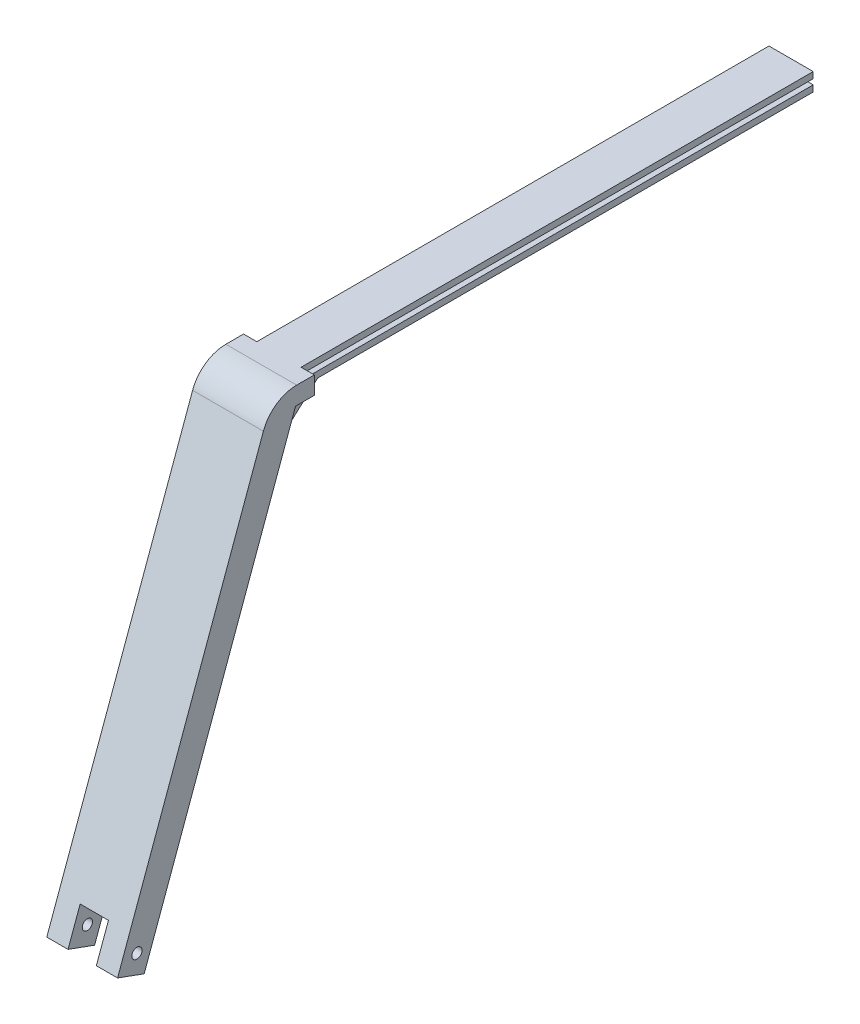
ISO-10303-21;
HEADER;
FILE_DESCRIPTION(('STEP AP214'),'2;1');
FILE_NAME('part.step','',(''),(''),'','','');
FILE_SCHEMA(('AUTOMOTIVE_DESIGN { 1 0 10303 214 1 1 1 1 }'));
ENDSEC;
DATA;
#1=APPLICATION_CONTEXT('core data for automotive mechanical design processes');
#2=APPLICATION_PROTOCOL_DEFINITION('international standard','automotive_design',2000,#1);
#3=PRODUCT_CONTEXT('',#1,'mechanical');
#4=PRODUCT('Part','Part','',(#3));
#5=PRODUCT_RELATED_PRODUCT_CATEGORY('part','',(#4));
#6=PRODUCT_DEFINITION_FORMATION('','',#4);
#7=PRODUCT_DEFINITION_CONTEXT('part definition',#1,'design');
#8=PRODUCT_DEFINITION('design','',#6,#7);
#9=PRODUCT_DEFINITION_SHAPE('','',#8);
#10=(LENGTH_UNIT() NAMED_UNIT(*) SI_UNIT(.MILLI.,.METRE.));
#11=(NAMED_UNIT(*) PLANE_ANGLE_UNIT() SI_UNIT($,.RADIAN.));
#12=(NAMED_UNIT(*) SI_UNIT($,.STERADIAN.) SOLID_ANGLE_UNIT());
#13=UNCERTAINTY_MEASURE_WITH_UNIT(LENGTH_MEASURE(1.E-05),#10,'distance_accuracy_value','');
#14=(GEOMETRIC_REPRESENTATION_CONTEXT(3) GLOBAL_UNCERTAINTY_ASSIGNED_CONTEXT((#13)) GLOBAL_UNIT_ASSIGNED_CONTEXT((#10,
#11,#12)) REPRESENTATION_CONTEXT('',''));
#15=CARTESIAN_POINT('',(0.,0.,0.));
#16=DIRECTION('',(0.,0.,1.));
#17=DIRECTION('',(1.,0.,0.));
#18=AXIS2_PLACEMENT_3D('',#15,#16,#17);
#19=CARTESIAN_POINT('',(-10.,2.7361611466053,7.51754096628727));
#20=DIRECTION('',(0.,0.93969262078591,-0.342020143325663));
#21=DIRECTION('',(0.,0.342020143325663,0.939692620785911));
#22=AXIS2_PLACEMENT_3D('',#19,#20,#21);
#23=PLANE('',#22);
#24=DIRECTION('',(1.,0.,0.));
#25=VECTOR('',#24,1.);
#26=CARTESIAN_POINT('',(-10.,0.,0.));
#27=LINE('',#26,#25);
#28=CARTESIAN_POINT('',(-10.,0.,0.));
#29=VERTEX_POINT('',#28);
#30=CARTESIAN_POINT('',(-4.,0.,0.));
#31=VERTEX_POINT('',#30);
#32=EDGE_CURVE('E222',#29,#31,#27,.T.);
#33=ORIENTED_EDGE('',*,*,#32,.T.);
#34=DIRECTION('',(0.,0.342020143325663,0.939692620785911));
#35=VECTOR('',#34,1.);
#36=CARTESIAN_POINT('',(-4.,2.7361611466053,7.51754096628727));
#37=LINE('',#36,#35);
#38=CARTESIAN_POINT('',(-4.,2.73616114660533,7.51754096628727));
#39=VERTEX_POINT('',#38);
#40=EDGE_CURVE('E11',#31,#39,#37,.T.);
#41=ORIENTED_EDGE('',*,*,#40,.T.);
#42=DIRECTION('',(1.,0.,0.));
#43=VECTOR('',#42,1.);
#44=CARTESIAN_POINT('',(-10.,2.7361611466053,7.51754096628727));
#45=LINE('',#44,#43);
#46=CARTESIAN_POINT('',(-10.,2.73616114660533,7.51754096628727));
#47=VERTEX_POINT('',#46);
#48=EDGE_CURVE('E58',#47,#39,#45,.T.);
#49=ORIENTED_EDGE('',*,*,#48,.F.);
#50=DIRECTION('',(0.,0.342020143325663,0.93969262078591));
#51=VECTOR('',#50,1.);
#52=CARTESIAN_POINT('',(-10.,2.7361611466053,7.51754096628727));
#53=LINE('',#52,#51);
#54=EDGE_CURVE('E400',#29,#47,#53,.T.);
#55=ORIENTED_EDGE('',*,*,#54,.F.);
#56=EDGE_LOOP('',(#33,#41,#49,#55));
#57=FACE_BOUND('',#56,.T.);
#58=ADVANCED_FACE('F35',(#57),#23,.F.);
#59=CARTESIAN_POINT('',(-6.25,-192.,-192.766502526278));
#60=DIRECTION('',(1.,0.,0.));
#61=DIRECTION('',(0.,0.,-1.));
#62=AXIS2_PLACEMENT_3D('',#59,#60,#61);
#63=PLANE('',#62);
#64=DIRECTION('',(0.,1.,0.));
#65=VECTOR('',#64,1.);
#66=CARTESIAN_POINT('',(-6.25,-192.,-192.766502526278));
#67=LINE('',#66,#65);
#68=CARTESIAN_POINT('',(-6.25,120.75,-192.766502526278));
#69=VERTEX_POINT('',#68);
#70=CARTESIAN_POINT('',(-6.25,122.5,-192.766502526278));
#71=VERTEX_POINT('',#70);
#72=EDGE_CURVE('E320',#69,#71,#67,.T.);
#73=ORIENTED_EDGE('',*,*,#72,.F.);
#74=DIRECTION('',(0.,0.,-1.));
#75=VECTOR('',#74,1.);
#76=CARTESIAN_POINT('',(-6.25,120.75,-48.0750068998992));
#77=LINE('',#76,#75);
#78=CARTESIAN_POINT('',(-6.25,120.75,-48.0750068998992));
#79=VERTEX_POINT('',#78);
#80=EDGE_CURVE('E254',#79,#69,#77,.T.);
#81=ORIENTED_EDGE('',*,*,#80,.F.);
#82=DIRECTION('',(0.,1.,0.));
#83=VECTOR('',#82,1.);
#84=CARTESIAN_POINT('',(-6.25,-192.,-48.0750068998992));
#85=LINE('',#84,#83);
#86=CARTESIAN_POINT('',(-6.25,122.5,-48.0750068998992));
#87=VERTEX_POINT('',#86);
#88=EDGE_CURVE('E315',#79,#87,#85,.T.);
#89=ORIENTED_EDGE('',*,*,#88,.T.);
#90=DIRECTION('',(0.,0.,-1.));
#91=VECTOR('',#90,1.);
#92=CARTESIAN_POINT('',(-6.25,122.5,-192.766502526278));
#93=LINE('',#92,#91);
#94=EDGE_CURVE('E311',#87,#71,#93,.T.);
#95=ORIENTED_EDGE('',*,*,#94,.T.);
#96=EDGE_LOOP('',(#73,#81,#89,#95));
#97=FACE_BOUND('',#96,.T.);
#98=ADVANCED_FACE('F442',(#97),#63,.F.);
#99=CARTESIAN_POINT('',(6.25,-192.,-192.766502526278));
#100=DIRECTION('',(-1.,0.,0.));
#101=DIRECTION('',(0.,0.,1.));
#102=AXIS2_PLACEMENT_3D('',#99,#100,#101);
#103=PLANE('',#102);
#104=DIRECTION('',(0.,1.,0.));
#105=VECTOR('',#104,1.);
#106=CARTESIAN_POINT('',(6.25,-192.,-48.0750068998992));
#107=LINE('',#106,#105);
#108=CARTESIAN_POINT('',(6.25,120.75,-48.0750068998992));
#109=VERTEX_POINT('',#108);
#110=CARTESIAN_POINT('',(6.25,122.5,-48.0750068998992));
#111=VERTEX_POINT('',#110);
#112=EDGE_CURVE('E331',#109,#111,#107,.T.);
#113=ORIENTED_EDGE('',*,*,#112,.F.);
#114=DIRECTION('',(0.,0.,-1.));
#115=VECTOR('',#114,1.);
#116=CARTESIAN_POINT('',(6.25,120.75,-48.0750068998992));
#117=LINE('',#116,#115);
#118=CARTESIAN_POINT('',(6.25,120.75,-192.766502526278));
#119=VERTEX_POINT('',#118);
#120=EDGE_CURVE('E258',#109,#119,#117,.T.);
#121=ORIENTED_EDGE('',*,*,#120,.T.);
#122=DIRECTION('',(0.,1.,0.));
#123=VECTOR('',#122,1.);
#124=CARTESIAN_POINT('',(6.25,-192.,-192.766502526278));
#125=LINE('',#124,#123);
#126=CARTESIAN_POINT('',(6.25,122.5,-192.766502526278));
#127=VERTEX_POINT('',#126);
#128=EDGE_CURVE('E328',#119,#127,#125,.T.);
#129=ORIENTED_EDGE('',*,*,#128,.T.);
#130=DIRECTION('',(0.,0.,1.));
#131=VECTOR('',#130,1.);
#132=CARTESIAN_POINT('',(6.25,122.5,-192.766502526278));
#133=LINE('',#132,#131);
#134=EDGE_CURVE('E306',#127,#111,#133,.T.);
#135=ORIENTED_EDGE('',*,*,#134,.T.);
#136=EDGE_LOOP('',(#113,#121,#129,#135));
#137=FACE_BOUND('',#136,.T.);
#138=ADVANCED_FACE('F447',(#137),#103,.F.);
#139=CARTESIAN_POINT('',(10.,-117.5,42.7665025262783));
#140=DIRECTION('',(0.,0.342020143325665,0.93969262078591));
#141=DIRECTION('',(0.,-0.93969262078591,0.342020143325665));
#142=AXIS2_PLACEMENT_3D('',#139,#140,#141);
#143=PLANE('',#142);
#144=DIRECTION('',(-1.,0.,0.));
#145=VECTOR('',#144,1.);
#146=CARTESIAN_POINT('',(9.99999999999997,9.39692620785909,-3.42020143325663));
#147=LINE('',#146,#145);
#148=CARTESIAN_POINT('',(4.,9.39692620785912,-3.42020143325664));
#149=VERTEX_POINT('',#148);
#150=CARTESIAN_POINT('',(-4.,9.3969262078591,-3.42020143325664));
#151=VERTEX_POINT('',#150);
#152=EDGE_CURVE('E403',#149,#151,#147,.T.);
#153=ORIENTED_EDGE('',*,*,#152,.T.);
#154=DIRECTION('',(0.,-0.93969262078591,0.342020143325665));
#155=VECTOR('',#154,1.);
#156=CARTESIAN_POINT('',(-4.,-117.5,42.7665025262783));
#157=LINE('',#156,#155);
#158=EDGE_CURVE('E406',#151,#31,#157,.T.);
#159=ORIENTED_EDGE('',*,*,#158,.T.);
#160=ORIENTED_EDGE('',*,*,#32,.F.);
#161=DIRECTION('',(0.,0.939692620785909,-0.342020143325665));
#162=VECTOR('',#161,1.);
#163=CARTESIAN_POINT('',(-10.,-117.5,42.7665025262783));
#164=LINE('',#163,#162);
#165=CARTESIAN_POINT('',(-10.,117.5,-42.7665025262783));
#166=VERTEX_POINT('',#165);
#167=EDGE_CURVE('E359',#29,#166,#164,.T.);
#168=ORIENTED_EDGE('',*,*,#167,.T.);
#169=DIRECTION('',(-1.,0.,0.));
#170=VECTOR('',#169,1.);
#171=CARTESIAN_POINT('',(10.,117.5,-42.7665025262783));
#172=LINE('',#171,#170);
#173=CARTESIAN_POINT('',(-6.25,117.5,-42.7665025262783));
#174=VERTEX_POINT('',#173);
#175=EDGE_CURVE('E368',#174,#166,#172,.T.);
#176=ORIENTED_EDGE('',*,*,#175,.F.);
#177=DIRECTION('',(0.,-0.939692620785909,0.342020143325666));
#178=VECTOR('',#177,1.);
#179=CARTESIAN_POINT('',(-6.25,103.762612902727,-37.7665025262783));
#180=LINE('',#179,#178);
#181=CARTESIAN_POINT('',(-6.25,103.762612902727,-37.7665025262783));
#182=VERTEX_POINT('',#181);
#183=EDGE_CURVE('E289',#174,#182,#180,.T.);
#184=ORIENTED_EDGE('',*,*,#183,.T.);
#185=DIRECTION('',(1.,0.,0.));
#186=VECTOR('',#185,1.);
#187=CARTESIAN_POINT('',(-6.25,103.762612902727,-37.7665025262783));
#188=LINE('',#187,#186);
#189=CARTESIAN_POINT('',(6.25,103.762612902727,-37.7665025262783));
#190=VERTEX_POINT('',#189);
#191=EDGE_CURVE('E295',#182,#190,#188,.T.);
#192=ORIENTED_EDGE('',*,*,#191,.T.);
#193=DIRECTION('',(0.,-0.939692620785909,0.342020143325666));
#194=VECTOR('',#193,1.);
#195=CARTESIAN_POINT('',(6.25,103.762612902727,-37.7665025262783));
#196=LINE('',#195,#194);
#197=CARTESIAN_POINT('',(6.25,117.5,-42.7665025262783));
#198=VERTEX_POINT('',#197);
#199=EDGE_CURVE('E298',#198,#190,#196,.T.);
#200=ORIENTED_EDGE('',*,*,#199,.F.);
#201=CARTESIAN_POINT('',(10.,117.5,-42.7665025262783));
#202=VERTEX_POINT('',#201);
#203=EDGE_CURVE('E369',#202,#198,#172,.T.);
#204=ORIENTED_EDGE('',*,*,#203,.F.);
#205=DIRECTION('',(0.,0.939692620785909,-0.342020143325665));
#206=VECTOR('',#205,1.);
#207=CARTESIAN_POINT('',(10.,-117.5,42.7665025262783));
#208=LINE('',#207,#206);
#209=CARTESIAN_POINT('',(10.,0.,0.));
#210=VERTEX_POINT('',#209);
#211=EDGE_CURVE('E351',#210,#202,#208,.T.);
#212=ORIENTED_EDGE('',*,*,#211,.F.);
#213=CARTESIAN_POINT('',(4.,0.,0.));
#214=VERTEX_POINT('',#213);
#215=EDGE_CURVE('E239',#214,#210,#27,.T.);
#216=ORIENTED_EDGE('',*,*,#215,.F.);
#217=DIRECTION('',(0.,0.93969262078591,-0.342020143325665));
#218=VECTOR('',#217,1.);
#219=CARTESIAN_POINT('',(4.00000000000005,-117.5,42.7665025262783));
#220=LINE('',#219,#218);
#221=EDGE_CURVE('E51',#214,#149,#220,.T.);
#222=ORIENTED_EDGE('',*,*,#221,.T.);
#223=EDGE_LOOP('',(#153,#159,#160,#168,#176,#184,#192,#200,#204,#212,#216,#222));
#224=FACE_BOUND('',#223,.T.);
#225=ADVANCED_FACE('F398',(#224),#143,.F.);
#226=CARTESIAN_POINT('',(10.,117.5,-192.766502526278));
#227=DIRECTION('',(0.,1.,0.));
#228=DIRECTION('',(0.,0.,1.));
#229=AXIS2_PLACEMENT_3D('',#226,#227,#228);
#230=PLANE('',#229);
#231=DIRECTION('',(0.,0.,1.));
#232=VECTOR('',#231,1.);
#233=CARTESIAN_POINT('',(-6.25,117.5,-42.7665025262783));
#234=LINE('',#233,#232);
#235=CARTESIAN_POINT('',(-6.25,117.5,-48.0750068998992));
#236=VERTEX_POINT('',#235);
#237=EDGE_CURVE('E287',#236,#174,#234,.T.);
#238=ORIENTED_EDGE('',*,*,#237,.T.);
#239=ORIENTED_EDGE('',*,*,#175,.T.);
#240=DIRECTION('',(0.,0.,-1.));
#241=VECTOR('',#240,1.);
#242=CARTESIAN_POINT('',(-10.,117.5,-192.766502526278));
#243=LINE('',#242,#241);
#244=CARTESIAN_POINT('',(-10.,117.5,-48.0750068998992));
#245=VERTEX_POINT('',#244);
#246=EDGE_CURVE('E348',#166,#245,#243,.T.);
#247=ORIENTED_EDGE('',*,*,#246,.T.);
#248=DIRECTION('',(1.,0.,0.));
#249=VECTOR('',#248,1.);
#250=CARTESIAN_POINT('',(10.,117.5,-48.0750068998992));
#251=LINE('',#250,#249);
#252=EDGE_CURVE('E319',#245,#236,#251,.T.);
#253=ORIENTED_EDGE('',*,*,#252,.T.);
#254=EDGE_LOOP('',(#238,#239,#247,#253));
#255=FACE_BOUND('',#254,.T.);
#256=ADVANCED_FACE('F510',(#255),#230,.F.);
#257=DIRECTION('',(0.,0.,1.));
#258=VECTOR('',#257,1.);
#259=CARTESIAN_POINT('',(6.25,117.5,-192.766502526278));
#260=LINE('',#259,#258);
#261=CARTESIAN_POINT('',(6.25,117.5,-192.766502526278));
#262=VERTEX_POINT('',#261);
#263=CARTESIAN_POINT('',(6.25,117.5,-52.7665025262783));
#264=VERTEX_POINT('',#263);
#265=EDGE_CURVE('E340',#262,#264,#260,.T.);
#266=ORIENTED_EDGE('',*,*,#265,.T.);
#267=DIRECTION('',(1.,0.,0.));
#268=VECTOR('',#267,1.);
#269=CARTESIAN_POINT('',(-6.25,117.5,-52.7665025262783));
#270=LINE('',#269,#268);
#271=CARTESIAN_POINT('',(-6.25,117.5,-52.7665025262783));
#272=VERTEX_POINT('',#271);
#273=EDGE_CURVE('E303',#272,#264,#270,.T.);
#274=ORIENTED_EDGE('',*,*,#273,.F.);
#275=DIRECTION('',(0.,0.,-1.));
#276=VECTOR('',#275,1.);
#277=CARTESIAN_POINT('',(-6.25,117.5,-192.766502526278));
#278=LINE('',#277,#276);
#279=CARTESIAN_POINT('',(-6.25,117.5,-192.766502526278));
#280=VERTEX_POINT('',#279);
#281=EDGE_CURVE('E342',#272,#280,#278,.T.);
#282=ORIENTED_EDGE('',*,*,#281,.T.);
#283=DIRECTION('',(-1.,0.,0.));
#284=VECTOR('',#283,1.);
#285=CARTESIAN_POINT('',(10.,117.5,-192.766502526278));
#286=LINE('',#285,#284);
#287=EDGE_CURVE('E365',#262,#280,#286,.T.);
#288=ORIENTED_EDGE('',*,*,#287,.F.);
#289=EDGE_LOOP('',(#266,#274,#282,#288));
#290=FACE_BOUND('',#289,.T.);
#291=ADVANCED_FACE('F511',(#290),#230,.F.);
#292=CARTESIAN_POINT('',(10.,122.5,-192.766502526278));
#293=DIRECTION('',(0.,-1.,0.));
#294=DIRECTION('',(0.,0.,-1.));
#295=AXIS2_PLACEMENT_3D('',#292,#293,#294);
#296=PLANE('',#295);
#297=DIRECTION('',(-1.,0.,0.));
#298=VECTOR('',#297,1.);
#299=CARTESIAN_POINT('',(10.,122.5,-192.766502526278));
#300=LINE('',#299,#298);
#301=EDGE_CURVE('E356',#127,#71,#300,.T.);
#302=ORIENTED_EDGE('',*,*,#301,.T.);
#303=ORIENTED_EDGE('',*,*,#94,.F.);
#304=DIRECTION('',(1.,0.,0.));
#305=VECTOR('',#304,1.);
#306=CARTESIAN_POINT('',(-10.,122.5,-48.0750068998992));
#307=LINE('',#306,#305);
#308=CARTESIAN_POINT('',(-10.,122.5,-48.0750068998992));
#309=VERTEX_POINT('',#308);
#310=EDGE_CURVE('E308',#309,#87,#307,.T.);
#311=ORIENTED_EDGE('',*,*,#310,.F.);
#312=DIRECTION('',(0.,0.,1.));
#313=VECTOR('',#312,1.);
#314=CARTESIAN_POINT('',(-10.,122.5,-192.766502526278));
#315=LINE('',#314,#313);
#316=CARTESIAN_POINT('',(-10.,122.5,-43.0750068998992));
#317=VERTEX_POINT('',#316);
#318=EDGE_CURVE('E344',#309,#317,#315,.T.);
#319=ORIENTED_EDGE('',*,*,#318,.T.);
#320=DIRECTION('',(-1.,0.,0.));
#321=VECTOR('',#320,1.);
#322=CARTESIAN_POINT('',(10.,122.5,-43.0750068998992));
#323=LINE('',#322,#321);
#324=CARTESIAN_POINT('',(10.,122.5,-43.0750068998992));
#325=VERTEX_POINT('',#324);
#326=EDGE_CURVE('E377',#317,#325,#323,.F.);
#327=ORIENTED_EDGE('',*,*,#326,.T.);
#328=DIRECTION('',(0.,0.,1.));
#329=VECTOR('',#328,1.);
#330=CARTESIAN_POINT('',(10.,122.5,-192.766502526278));
#331=LINE('',#330,#329);
#332=CARTESIAN_POINT('',(10.,122.5,-48.0750068998992));
#333=VERTEX_POINT('',#332);
#334=EDGE_CURVE('E345',#333,#325,#331,.T.);
#335=ORIENTED_EDGE('',*,*,#334,.F.);
#336=DIRECTION('',(1.,0.,0.));
#337=VECTOR('',#336,1.);
#338=CARTESIAN_POINT('',(10.,122.5,-48.0750068998992));
#339=LINE('',#338,#337);
#340=EDGE_CURVE('E326',#111,#333,#339,.T.);
#341=ORIENTED_EDGE('',*,*,#340,.F.);
#342=ORIENTED_EDGE('',*,*,#134,.F.);
#343=EDGE_LOOP('',(#302,#303,#311,#319,#327,#335,#341,#342));
#344=FACE_BOUND('',#343,.T.);
#345=ADVANCED_FACE('F515',(#344),#296,.F.);
#346=CARTESIAN_POINT('',(10.,122.5,-36.0729315178021));
#347=DIRECTION('',(0.,-0.342020143325666,-0.93969262078591));
#348=DIRECTION('',(0.,0.93969262078591,-0.342020143325666));
#349=AXIS2_PLACEMENT_3D('',#346,#347,#348);
#350=PLANE('',#349);
#351=ORIENTED_EDGE('',*,*,#48,.T.);
#352=DIRECTION('',(0.,-0.939692620785909,0.342020143325666));
#353=VECTOR('',#352,1.);
#354=CARTESIAN_POINT('',(-4.,2.73616114660533,7.51754096628727));
#355=LINE('',#354,#353);
#356=CARTESIAN_POINT('',(-4.,12.1330873544644,4.09733953303061));
#357=VERTEX_POINT('',#356);
#358=EDGE_CURVE('E209',#357,#39,#355,.T.);
#359=ORIENTED_EDGE('',*,*,#358,.F.);
#360=DIRECTION('',(-1.,0.,0.));
#361=VECTOR('',#360,1.);
#362=CARTESIAN_POINT('',(-4.,12.1330873544644,4.09733953303061));
#363=LINE('',#362,#361);
#364=CARTESIAN_POINT('',(4.,12.1330873544644,4.09733953303061));
#365=VERTEX_POINT('',#364);
#366=EDGE_CURVE('E411',#365,#357,#363,.T.);
#367=ORIENTED_EDGE('',*,*,#366,.F.);
#368=DIRECTION('',(0.,0.93969262078591,-0.342020143325666));
#369=VECTOR('',#368,1.);
#370=CARTESIAN_POINT('',(4.,2.73616114660533,7.51754096628727));
#371=LINE('',#370,#369);
#372=CARTESIAN_POINT('',(4.,2.73616114660533,7.51754096628727));
#373=VERTEX_POINT('',#372);
#374=EDGE_CURVE('E217',#373,#365,#371,.T.);
#375=ORIENTED_EDGE('',*,*,#374,.F.);
#376=CARTESIAN_POINT('',(10.,2.7361611466053,7.51754096628727));
#377=VERTEX_POINT('',#376);
#378=EDGE_CURVE('E229',#373,#377,#45,.T.);
#379=ORIENTED_EDGE('',*,*,#378,.T.);
#380=DIRECTION('',(0.,-0.939692620785909,0.342020143325666));
#381=VECTOR('',#380,1.);
#382=CARTESIAN_POINT('',(10.,122.5,-36.0729315178021));
#383=LINE('',#382,#381);
#384=CARTESIAN_POINT('',(10.,115.920201433257,-33.6780806920401));
#385=VERTEX_POINT('',#384);
#386=EDGE_CURVE('E347',#385,#377,#383,.T.);
#387=ORIENTED_EDGE('',*,*,#386,.F.);
#388=DIRECTION('',(-1.,0.,0.));
#389=VECTOR('',#388,1.);
#390=CARTESIAN_POINT('',(10.,115.920201433257,-33.6780806920401));
#391=LINE('',#390,#389);
#392=CARTESIAN_POINT('',(-10.,115.920201433257,-33.6780806920401));
#393=VERTEX_POINT('',#392);
#394=EDGE_CURVE('E372',#385,#393,#391,.T.);
#395=ORIENTED_EDGE('',*,*,#394,.T.);
#396=DIRECTION('',(0.,-0.939692620785909,0.342020143325666));
#397=VECTOR('',#396,1.);
#398=CARTESIAN_POINT('',(-10.,122.5,-36.0729315178021));
#399=LINE('',#398,#397);
#400=EDGE_CURVE('E227',#393,#47,#399,.T.);
#401=ORIENTED_EDGE('',*,*,#400,.T.);
#402=EDGE_LOOP('',(#351,#359,#367,#375,#379,#387,#395,#401));
#403=FACE_BOUND('',#402,.T.);
#404=ADVANCED_FACE('F224',(#403),#350,.F.);
#405=ORIENTED_EDGE('',*,*,#203,.T.);
#406=DIRECTION('',(0.,0.,1.));
#407=VECTOR('',#406,1.);
#408=CARTESIAN_POINT('',(6.25,117.5,-42.7665025262783));
#409=LINE('',#408,#407);
#410=CARTESIAN_POINT('',(6.25,117.5,-48.0750068998992));
#411=VERTEX_POINT('',#410);
#412=EDGE_CURVE('E261',#411,#198,#409,.T.);
#413=ORIENTED_EDGE('',*,*,#412,.F.);
#414=DIRECTION('',(1.,0.,0.));
#415=VECTOR('',#414,1.);
#416=CARTESIAN_POINT('',(10.,117.5,-48.0750068998992));
#417=LINE('',#416,#415);
#418=CARTESIAN_POINT('',(10.,117.5,-48.0750068998992));
#419=VERTEX_POINT('',#418);
#420=EDGE_CURVE('E337',#411,#419,#417,.T.);
#421=ORIENTED_EDGE('',*,*,#420,.T.);
#422=DIRECTION('',(0.,0.,-1.));
#423=VECTOR('',#422,1.);
#424=CARTESIAN_POINT('',(10.,117.5,-192.766502526278));
#425=LINE('',#424,#423);
#426=EDGE_CURVE('E353',#202,#419,#425,.T.);
#427=ORIENTED_EDGE('',*,*,#426,.F.);
#428=EDGE_LOOP('',(#405,#413,#421,#427));
#429=FACE_BOUND('',#428,.T.);
#430=ADVANCED_FACE('F505',(#429),#230,.F.);
#431=CARTESIAN_POINT('',(10.,122.5,-192.766502526278));
#432=DIRECTION('',(0.,0.,1.));
#433=DIRECTION('',(1.,0.,0.));
#434=AXIS2_PLACEMENT_3D('',#431,#432,#433);
#435=PLANE('',#434);
#436=ORIENTED_EDGE('',*,*,#128,.F.);
#437=DIRECTION('',(1.,0.,0.));
#438=VECTOR('',#437,1.);
#439=CARTESIAN_POINT('',(6.25,120.75,-192.766502526278));
#440=LINE('',#439,#438);
#441=CARTESIAN_POINT('',(4.25,120.75,-192.766502526278));
#442=VERTEX_POINT('',#441);
#443=EDGE_CURVE('E244',#442,#119,#440,.T.);
#444=ORIENTED_EDGE('',*,*,#443,.F.);
#445=DIRECTION('',(0.,1.,0.));
#446=VECTOR('',#445,1.);
#447=CARTESIAN_POINT('',(4.25,120.75,-192.766502526278));
#448=LINE('',#447,#446);
#449=CARTESIAN_POINT('',(4.25,119.25,-192.766502526278));
#450=VERTEX_POINT('',#449);
#451=EDGE_CURVE('E253',#450,#442,#448,.T.);
#452=ORIENTED_EDGE('',*,*,#451,.F.);
#453=DIRECTION('',(-1.,0.,0.));
#454=VECTOR('',#453,1.);
#455=CARTESIAN_POINT('',(6.25,119.25,-192.766502526278));
#456=LINE('',#455,#454);
#457=CARTESIAN_POINT('',(6.25,119.25,-192.766502526278));
#458=VERTEX_POINT('',#457);
#459=EDGE_CURVE('E250',#458,#450,#456,.T.);
#460=ORIENTED_EDGE('',*,*,#459,.F.);
#461=EDGE_CURVE('E332',#262,#458,#125,.T.);
#462=ORIENTED_EDGE('',*,*,#461,.F.);
#463=ORIENTED_EDGE('',*,*,#287,.T.);
#464=CARTESIAN_POINT('',(-6.25,119.25,-192.766502526278));
#465=VERTEX_POINT('',#464);
#466=EDGE_CURVE('E316',#280,#465,#67,.T.);
#467=ORIENTED_EDGE('',*,*,#466,.T.);
#468=DIRECTION('',(-1.,0.,0.));
#469=VECTOR('',#468,1.);
#470=CARTESIAN_POINT('',(-6.25,119.25,-192.766502526278));
#471=LINE('',#470,#469);
#472=CARTESIAN_POINT('',(-4.25,119.25,-192.766502526278));
#473=VERTEX_POINT('',#472);
#474=EDGE_CURVE('E271',#473,#465,#471,.T.);
#475=ORIENTED_EDGE('',*,*,#474,.F.);
#476=DIRECTION('',(0.,-1.,0.));
#477=VECTOR('',#476,1.);
#478=CARTESIAN_POINT('',(-4.25,120.75,-192.766502526278));
#479=LINE('',#478,#477);
#480=CARTESIAN_POINT('',(-4.25,120.75,-192.766502526278));
#481=VERTEX_POINT('',#480);
#482=EDGE_CURVE('E232',#481,#473,#479,.T.);
#483=ORIENTED_EDGE('',*,*,#482,.F.);
#484=DIRECTION('',(1.,0.,0.));
#485=VECTOR('',#484,1.);
#486=CARTESIAN_POINT('',(-6.25,120.75,-192.766502526278));
#487=LINE('',#486,#485);
#488=EDGE_CURVE('E228',#69,#481,#487,.T.);
#489=ORIENTED_EDGE('',*,*,#488,.F.);
#490=ORIENTED_EDGE('',*,*,#72,.T.);
#491=ORIENTED_EDGE('',*,*,#301,.F.);
#492=EDGE_LOOP('',(#436,#444,#452,#460,#462,#463,#467,#475,#483,#489,#490,#491));
#493=FACE_BOUND('',#492,.T.);
#494=ADVANCED_FACE('F499',(#493),#435,.F.);
#495=CARTESIAN_POINT('',(10.,0.,0.));
#496=DIRECTION('',(1.,0.,0.));
#497=DIRECTION('',(0.,0.,-1.));
#498=AXIS2_PLACEMENT_3D('',#495,#496,#497);
#499=PLANE('',#498);
#500=CARTESIAN_POINT('',(10.,6.06654367723219,2.04866976651531));
#501=DIRECTION('',(1.,0.,0.));
#502=DIRECTION('',(0.,0.,-1.));
#503=AXIS2_PLACEMENT_3D('',#500,#501,#502);
#504=CIRCLE('',#503,1.45);
#505=CARTESIAN_POINT('',(10.,6.06654367723219,0.598669766515311));
#506=VERTEX_POINT('',#505);
#507=EDGE_CURVE('E417',#506,#506,#504,.T.);
#508=ORIENTED_EDGE('',*,*,#507,.F.);
#509=EDGE_LOOP('',(#508));
#510=FACE_BOUND('',#509,.T.);
#511=DIRECTION('',(0.,0.342020143325663,0.93969262078591));
#512=VECTOR('',#511,1.);
#513=CARTESIAN_POINT('',(10.,2.7361611466053,7.51754096628727));
#514=LINE('',#513,#512);
#515=EDGE_CURVE('E236',#210,#377,#514,.T.);
#516=ORIENTED_EDGE('',*,*,#515,.F.);
#517=ORIENTED_EDGE('',*,*,#211,.T.);
#518=ORIENTED_EDGE('',*,*,#426,.T.);
#519=DIRECTION('',(0.,-1.,0.));
#520=VECTOR('',#519,1.);
#521=CARTESIAN_POINT('',(10.,0.,-48.0750068998992));
#522=LINE('',#521,#520);
#523=EDGE_CURVE('E385',#333,#419,#522,.T.);
#524=ORIENTED_EDGE('',*,*,#523,.F.);
#525=ORIENTED_EDGE('',*,*,#334,.T.);
#526=CARTESIAN_POINT('',(10.,112.5,-43.0750068998992));
#527=DIRECTION('',(1.,0.,0.));
#528=DIRECTION('',(0.,0.,-1.));
#529=AXIS2_PLACEMENT_3D('',#526,#527,#528);
#530=CIRCLE('',#529,10.);
#531=EDGE_CURVE('E380',#325,#385,#530,.T.);
#532=ORIENTED_EDGE('',*,*,#531,.T.);
#533=ORIENTED_EDGE('',*,*,#386,.T.);
#534=EDGE_LOOP('',(#516,#517,#518,#524,#525,#532,#533));
#535=FACE_BOUND('',#534,.T.);
#536=ADVANCED_FACE('F495',(#510,#535),#499,.T.);
#537=CARTESIAN_POINT('',(-10.,0.,0.));
#538=DIRECTION('',(1.,0.,0.));
#539=DIRECTION('',(0.,0.,-1.));
#540=AXIS2_PLACEMENT_3D('',#537,#538,#539);
#541=PLANE('',#540);
#542=CARTESIAN_POINT('',(-10.,6.06654367723219,2.04866976651531));
#543=DIRECTION('',(1.,0.,0.));
#544=DIRECTION('',(0.,0.,-1.));
#545=AXIS2_PLACEMENT_3D('',#542,#543,#544);
#546=CIRCLE('',#545,1.45);
#547=CARTESIAN_POINT('',(-10.,6.06654367723219,0.598669766515311));
#548=VERTEX_POINT('',#547);
#549=EDGE_CURVE('E420',#548,#548,#546,.T.);
#550=ORIENTED_EDGE('',*,*,#549,.T.);
#551=EDGE_LOOP('',(#550));
#552=FACE_BOUND('',#551,.T.);
#553=ORIENTED_EDGE('',*,*,#167,.F.);
#554=ORIENTED_EDGE('',*,*,#54,.T.);
#555=ORIENTED_EDGE('',*,*,#400,.F.);
#556=CARTESIAN_POINT('',(-10.,112.5,-43.0750068998992));
#557=DIRECTION('',(1.,0.,0.));
#558=DIRECTION('',(0.,0.,-1.));
#559=AXIS2_PLACEMENT_3D('',#556,#557,#558);
#560=CIRCLE('',#559,10.);
#561=EDGE_CURVE('E374',#393,#317,#560,.F.);
#562=ORIENTED_EDGE('',*,*,#561,.T.);
#563=ORIENTED_EDGE('',*,*,#318,.F.);
#564=DIRECTION('',(0.,-1.,0.));
#565=VECTOR('',#564,1.);
#566=CARTESIAN_POINT('',(-10.,0.,-48.0750068998992));
#567=LINE('',#566,#565);
#568=EDGE_CURVE('E382',#309,#245,#567,.T.);
#569=ORIENTED_EDGE('',*,*,#568,.T.);
#570=ORIENTED_EDGE('',*,*,#246,.F.);
#571=EDGE_LOOP('',(#553,#554,#555,#562,#563,#569,#570));
#572=FACE_BOUND('',#571,.T.);
#573=ADVANCED_FACE('F498',(#552,#572),#541,.F.);
#574=CARTESIAN_POINT('',(10.,112.5,-43.0750068998992));
#575=DIRECTION('',(-1.,0.,0.));
#576=DIRECTION('',(0.,0.,1.));
#577=AXIS2_PLACEMENT_3D('',#574,#575,#576);
#578=CYLINDRICAL_SURFACE('',#577,10.);
#579=ORIENTED_EDGE('',*,*,#531,.F.);
#580=ORIENTED_EDGE('',*,*,#326,.F.);
#581=ORIENTED_EDGE('',*,*,#561,.F.);
#582=ORIENTED_EDGE('',*,*,#394,.F.);
#583=EDGE_LOOP('',(#579,#580,#581,#582));
#584=FACE_BOUND('',#583,.T.);
#585=ADVANCED_FACE('F37',(#584),#578,.T.);
#586=CARTESIAN_POINT('',(-6.25,119.25,-48.0750068998992));
#587=VERTEX_POINT('',#586);
#588=EDGE_CURVE('E321',#236,#587,#85,.T.);
#589=ORIENTED_EDGE('',*,*,#588,.T.);
#590=DIRECTION('',(0.,0.,-1.));
#591=VECTOR('',#590,1.);
#592=CARTESIAN_POINT('',(-6.25,119.25,-48.0750068998992));
#593=LINE('',#592,#591);
#594=EDGE_CURVE('E281',#587,#465,#593,.T.);
#595=ORIENTED_EDGE('',*,*,#594,.T.);
#596=ORIENTED_EDGE('',*,*,#466,.F.);
#597=ORIENTED_EDGE('',*,*,#281,.F.);
#598=DIRECTION('',(0.,0.675387596167753,-0.737462944792987));
#599=VECTOR('',#598,1.);
#600=CARTESIAN_POINT('',(-6.25,117.5,-52.7665025262783));
#601=LINE('',#600,#599);
#602=EDGE_CURVE('E292',#182,#272,#601,.T.);
#603=ORIENTED_EDGE('',*,*,#602,.F.);
#604=ORIENTED_EDGE('',*,*,#183,.F.);
#605=ORIENTED_EDGE('',*,*,#237,.F.);
#606=EDGE_LOOP('',(#589,#595,#596,#597,#603,#604,#605));
#607=FACE_BOUND('',#606,.T.);
#608=ADVANCED_FACE('F450',(#607),#63,.F.);
#609=CARTESIAN_POINT('',(-10.,-192.,-48.0750068998992));
#610=DIRECTION('',(0.,0.,1.));
#611=DIRECTION('',(1.,0.,0.));
#612=AXIS2_PLACEMENT_3D('',#609,#610,#611);
#613=PLANE('',#612);
#614=ORIENTED_EDGE('',*,*,#568,.F.);
#615=ORIENTED_EDGE('',*,*,#310,.T.);
#616=ORIENTED_EDGE('',*,*,#88,.F.);
#617=DIRECTION('',(1.,0.,0.));
#618=VECTOR('',#617,1.);
#619=CARTESIAN_POINT('',(-6.25,120.75,-48.0750068998992));
#620=LINE('',#619,#618);
#621=CARTESIAN_POINT('',(-4.25,120.75,-48.0750068998992));
#622=VERTEX_POINT('',#621);
#623=EDGE_CURVE('E267',#79,#622,#620,.T.);
#624=ORIENTED_EDGE('',*,*,#623,.T.);
#625=DIRECTION('',(0.,-1.,0.));
#626=VECTOR('',#625,1.);
#627=CARTESIAN_POINT('',(-4.25,120.75,-48.0750068998992));
#628=LINE('',#627,#626);
#629=CARTESIAN_POINT('',(-4.25,119.25,-48.0750068998992));
#630=VERTEX_POINT('',#629);
#631=EDGE_CURVE('E270',#622,#630,#628,.T.);
#632=ORIENTED_EDGE('',*,*,#631,.T.);
#633=DIRECTION('',(-1.,0.,0.));
#634=VECTOR('',#633,1.);
#635=CARTESIAN_POINT('',(-6.25,119.25,-48.0750068998992));
#636=LINE('',#635,#634);
#637=EDGE_CURVE('E274',#630,#587,#636,.T.);
#638=ORIENTED_EDGE('',*,*,#637,.T.);
#639=ORIENTED_EDGE('',*,*,#588,.F.);
#640=ORIENTED_EDGE('',*,*,#252,.F.);
#641=EDGE_LOOP('',(#614,#615,#616,#624,#632,#638,#639,#640));
#642=FACE_BOUND('',#641,.T.);
#643=ADVANCED_FACE('F483',(#642),#613,.F.);
#644=ORIENTED_EDGE('',*,*,#461,.T.);
#645=DIRECTION('',(0.,0.,-1.));
#646=VECTOR('',#645,1.);
#647=CARTESIAN_POINT('',(6.25,119.25,-48.0750068998992));
#648=LINE('',#647,#646);
#649=CARTESIAN_POINT('',(6.25,119.25,-48.0750068998992));
#650=VERTEX_POINT('',#649);
#651=EDGE_CURVE('E249',#650,#458,#648,.T.);
#652=ORIENTED_EDGE('',*,*,#651,.F.);
#653=EDGE_CURVE('E312',#411,#650,#107,.T.);
#654=ORIENTED_EDGE('',*,*,#653,.F.);
#655=ORIENTED_EDGE('',*,*,#412,.T.);
#656=ORIENTED_EDGE('',*,*,#199,.T.);
#657=DIRECTION('',(0.,0.675387596167753,-0.737462944792987));
#658=VECTOR('',#657,1.);
#659=CARTESIAN_POINT('',(6.25,117.5,-52.7665025262783));
#660=LINE('',#659,#658);
#661=EDGE_CURVE('E290',#190,#264,#660,.T.);
#662=ORIENTED_EDGE('',*,*,#661,.T.);
#663=ORIENTED_EDGE('',*,*,#265,.F.);
#664=EDGE_LOOP('',(#644,#652,#654,#655,#656,#662,#663));
#665=FACE_BOUND('',#664,.T.);
#666=ADVANCED_FACE('F487',(#665),#103,.F.);
#667=CARTESIAN_POINT('',(10.,-192.,-48.0750068998992));
#668=DIRECTION('',(0.,0.,1.));
#669=DIRECTION('',(1.,0.,0.));
#670=AXIS2_PLACEMENT_3D('',#667,#668,#669);
#671=PLANE('',#670);
#672=ORIENTED_EDGE('',*,*,#653,.T.);
#673=DIRECTION('',(-1.,0.,0.));
#674=VECTOR('',#673,1.);
#675=CARTESIAN_POINT('',(6.25,119.25,-48.0750068998992));
#676=LINE('',#675,#674);
#677=CARTESIAN_POINT('',(4.25,119.25,-48.0750068998992));
#678=VERTEX_POINT('',#677);
#679=EDGE_CURVE('E240',#650,#678,#676,.T.);
#680=ORIENTED_EDGE('',*,*,#679,.T.);
#681=DIRECTION('',(0.,1.,0.));
#682=VECTOR('',#681,1.);
#683=CARTESIAN_POINT('',(4.25,120.75,-48.0750068998992));
#684=LINE('',#683,#682);
#685=CARTESIAN_POINT('',(4.25,120.75,-48.0750068998992));
#686=VERTEX_POINT('',#685);
#687=EDGE_CURVE('E243',#678,#686,#684,.T.);
#688=ORIENTED_EDGE('',*,*,#687,.T.);
#689=DIRECTION('',(1.,0.,0.));
#690=VECTOR('',#689,1.);
#691=CARTESIAN_POINT('',(6.25,120.75,-48.0750068998992));
#692=LINE('',#691,#690);
#693=EDGE_CURVE('E247',#686,#109,#692,.T.);
#694=ORIENTED_EDGE('',*,*,#693,.T.);
#695=ORIENTED_EDGE('',*,*,#112,.T.);
#696=ORIENTED_EDGE('',*,*,#340,.T.);
#697=ORIENTED_EDGE('',*,*,#523,.T.);
#698=ORIENTED_EDGE('',*,*,#420,.F.);
#699=EDGE_LOOP('',(#672,#680,#688,#694,#695,#696,#697,#698));
#700=FACE_BOUND('',#699,.T.);
#701=ADVANCED_FACE('F479',(#700),#671,.F.);
#702=CARTESIAN_POINT('',(-6.25,117.5,-52.7665025262783));
#703=DIRECTION('',(0.,-0.737462944792987,-0.675387596167753));
#704=DIRECTION('',(0.,0.675387596167753,-0.737462944792987));
#705=AXIS2_PLACEMENT_3D('',#702,#703,#704);
#706=PLANE('',#705);
#707=ORIENTED_EDGE('',*,*,#661,.F.);
#708=ORIENTED_EDGE('',*,*,#191,.F.);
#709=ORIENTED_EDGE('',*,*,#602,.T.);
#710=ORIENTED_EDGE('',*,*,#273,.T.);
#711=EDGE_LOOP('',(#707,#708,#709,#710));
#712=FACE_BOUND('',#711,.T.);
#713=ADVANCED_FACE('F476',(#712),#706,.T.);
#714=CARTESIAN_POINT('',(6.25,120.75,-48.0750068998992));
#715=DIRECTION('',(0.,1.,0.));
#716=DIRECTION('',(0.,0.,1.));
#717=AXIS2_PLACEMENT_3D('',#714,#715,#716);
#718=PLANE('',#717);
#719=ORIENTED_EDGE('',*,*,#443,.T.);
#720=ORIENTED_EDGE('',*,*,#120,.F.);
#721=ORIENTED_EDGE('',*,*,#693,.F.);
#722=DIRECTION('',(0.,0.,-1.));
#723=VECTOR('',#722,1.);
#724=CARTESIAN_POINT('',(4.25,120.75,-48.0750068998992));
#725=LINE('',#724,#723);
#726=EDGE_CURVE('E262',#686,#442,#725,.T.);
#727=ORIENTED_EDGE('',*,*,#726,.T.);
#728=EDGE_LOOP('',(#719,#720,#721,#727));
#729=FACE_BOUND('',#728,.T.);
#730=ADVANCED_FACE('F478',(#729),#718,.F.);
#731=CARTESIAN_POINT('',(4.25,120.75,-48.0750068998992));
#732=DIRECTION('',(-1.,0.,0.));
#733=DIRECTION('',(0.,0.,1.));
#734=AXIS2_PLACEMENT_3D('',#731,#732,#733);
#735=PLANE('',#734);
#736=ORIENTED_EDGE('',*,*,#451,.T.);
#737=ORIENTED_EDGE('',*,*,#726,.F.);
#738=ORIENTED_EDGE('',*,*,#687,.F.);
#739=DIRECTION('',(0.,0.,-1.));
#740=VECTOR('',#739,1.);
#741=CARTESIAN_POINT('',(4.25,119.25,-48.0750068998992));
#742=LINE('',#741,#740);
#743=EDGE_CURVE('E264',#678,#450,#742,.T.);
#744=ORIENTED_EDGE('',*,*,#743,.T.);
#745=EDGE_LOOP('',(#736,#737,#738,#744));
#746=FACE_BOUND('',#745,.T.);
#747=ADVANCED_FACE('F555',(#746),#735,.F.);
#748=CARTESIAN_POINT('',(6.25,119.25,-48.0750068998992));
#749=DIRECTION('',(0.,-1.,0.));
#750=DIRECTION('',(0.,0.,-1.));
#751=AXIS2_PLACEMENT_3D('',#748,#749,#750);
#752=PLANE('',#751);
#753=ORIENTED_EDGE('',*,*,#459,.T.);
#754=ORIENTED_EDGE('',*,*,#743,.F.);
#755=ORIENTED_EDGE('',*,*,#679,.F.);
#756=ORIENTED_EDGE('',*,*,#651,.T.);
#757=EDGE_LOOP('',(#753,#754,#755,#756));
#758=FACE_BOUND('',#757,.T.);
#759=ADVANCED_FACE('F474',(#758),#752,.F.);
#760=CARTESIAN_POINT('',(-6.25,120.75,-48.0750068998992));
#761=DIRECTION('',(0.,1.,0.));
#762=DIRECTION('',(0.,0.,1.));
#763=AXIS2_PLACEMENT_3D('',#760,#761,#762);
#764=PLANE('',#763);
#765=ORIENTED_EDGE('',*,*,#488,.T.);
#766=DIRECTION('',(0.,0.,-1.));
#767=VECTOR('',#766,1.);
#768=CARTESIAN_POINT('',(-4.25,120.75,-48.0750068998992));
#769=LINE('',#768,#767);
#770=EDGE_CURVE('E275',#622,#481,#769,.T.);
#771=ORIENTED_EDGE('',*,*,#770,.F.);
#772=ORIENTED_EDGE('',*,*,#623,.F.);
#773=ORIENTED_EDGE('',*,*,#80,.T.);
#774=EDGE_LOOP('',(#765,#771,#772,#773));
#775=FACE_BOUND('',#774,.T.);
#776=ADVANCED_FACE('F467',(#775),#764,.F.);
#777=CARTESIAN_POINT('',(-6.25,119.25,-48.0750068998992));
#778=DIRECTION('',(0.,-1.,0.));
#779=DIRECTION('',(0.,0.,-1.));
#780=AXIS2_PLACEMENT_3D('',#777,#778,#779);
#781=PLANE('',#780);
#782=ORIENTED_EDGE('',*,*,#474,.T.);
#783=ORIENTED_EDGE('',*,*,#594,.F.);
#784=ORIENTED_EDGE('',*,*,#637,.F.);
#785=DIRECTION('',(0.,0.,-1.));
#786=VECTOR('',#785,1.);
#787=CARTESIAN_POINT('',(-4.25,119.25,-48.0750068998992));
#788=LINE('',#787,#786);
#789=EDGE_CURVE('E284',#630,#473,#788,.T.);
#790=ORIENTED_EDGE('',*,*,#789,.T.);
#791=EDGE_LOOP('',(#782,#783,#784,#790));
#792=FACE_BOUND('',#791,.T.);
#793=ADVANCED_FACE('F461',(#792),#781,.F.);
#794=CARTESIAN_POINT('',(-4.25,120.75,-48.0750068998992));
#795=DIRECTION('',(1.,0.,0.));
#796=DIRECTION('',(0.,0.,-1.));
#797=AXIS2_PLACEMENT_3D('',#794,#795,#796);
#798=PLANE('',#797);
#799=ORIENTED_EDGE('',*,*,#482,.T.);
#800=ORIENTED_EDGE('',*,*,#789,.F.);
#801=ORIENTED_EDGE('',*,*,#631,.F.);
#802=ORIENTED_EDGE('',*,*,#770,.T.);
#803=EDGE_LOOP('',(#799,#800,#801,#802));
#804=FACE_BOUND('',#803,.T.);
#805=ADVANCED_FACE('F455',(#804),#798,.F.);
#806=ORIENTED_EDGE('',*,*,#378,.F.);
#807=DIRECTION('',(0.,-0.342020143325663,-0.939692620785911));
#808=VECTOR('',#807,1.);
#809=CARTESIAN_POINT('',(4.,2.7361611466053,7.51754096628727));
#810=LINE('',#809,#808);
#811=EDGE_CURVE('E44',#373,#214,#810,.T.);
#812=ORIENTED_EDGE('',*,*,#811,.T.);
#813=ORIENTED_EDGE('',*,*,#215,.T.);
#814=ORIENTED_EDGE('',*,*,#515,.T.);
#815=EDGE_LOOP('',(#806,#812,#813,#814));
#816=FACE_BOUND('',#815,.T.);
#817=ADVANCED_FACE('F390',(#816),#23,.F.);
#818=CARTESIAN_POINT('',(-4.,-52.5570334853908,-173.637306736264));
#819=DIRECTION('',(0.,0.93969262078591,-0.342020143325666));
#820=DIRECTION('',(0.,0.342020143325666,0.93969262078591));
#821=AXIS2_PLACEMENT_3D('',#818,#819,#820);
#822=PLANE('',#821);
#823=DIRECTION('',(0.,0.342020143325666,0.93969262078591));
#824=VECTOR('',#823,1.);
#825=CARTESIAN_POINT('',(4.,-52.5570334853908,-173.637306736264));
#826=LINE('',#825,#824);
#827=EDGE_CURVE('E409',#149,#365,#826,.T.);
#828=ORIENTED_EDGE('',*,*,#827,.T.);
#829=ORIENTED_EDGE('',*,*,#366,.T.);
#830=DIRECTION('',(0.,0.342020143325666,0.93969262078591));
#831=VECTOR('',#830,1.);
#832=CARTESIAN_POINT('',(-4.,-52.5570334853908,-173.637306736264));
#833=LINE('',#832,#831);
#834=EDGE_CURVE('E213',#151,#357,#833,.T.);
#835=ORIENTED_EDGE('',*,*,#834,.F.);
#836=ORIENTED_EDGE('',*,*,#152,.F.);
#837=EDGE_LOOP('',(#828,#829,#835,#836));
#838=FACE_BOUND('',#837,.T.);
#839=ADVANCED_FACE('F454',(#838),#822,.F.);
#840=CARTESIAN_POINT('',(-4.,-61.9539596932499,-170.217105303008));
#841=DIRECTION('',(-1.,0.,0.));
#842=DIRECTION('',(0.,0.,1.));
#843=AXIS2_PLACEMENT_3D('',#840,#841,#842);
#844=PLANE('',#843);
#845=CARTESIAN_POINT('',(-4.,6.06654367723219,2.04866976651531));
#846=DIRECTION('',(-1.,0.,0.));
#847=DIRECTION('',(0.,0.,1.));
#848=AXIS2_PLACEMENT_3D('',#845,#846,#847);
#849=CIRCLE('',#848,1.45);
#850=CARTESIAN_POINT('',(-4.,6.06654367723219,3.49866976651531));
#851=VERTEX_POINT('',#850);
#852=EDGE_CURVE('E218',#851,#851,#849,.T.);
#853=ORIENTED_EDGE('',*,*,#852,.T.);
#854=EDGE_LOOP('',(#853));
#855=FACE_BOUND('',#854,.T.);
#856=ORIENTED_EDGE('',*,*,#834,.T.);
#857=ORIENTED_EDGE('',*,*,#358,.T.);
#858=ORIENTED_EDGE('',*,*,#40,.F.);
#859=ORIENTED_EDGE('',*,*,#158,.F.);
#860=EDGE_LOOP('',(#856,#857,#858,#859));
#861=FACE_BOUND('',#860,.T.);
#862=ADVANCED_FACE('F210',(#855,#861),#844,.F.);
#863=CARTESIAN_POINT('',(4.,-61.9539596932499,-170.217105303008));
#864=DIRECTION('',(1.,0.,0.));
#865=DIRECTION('',(0.,1.,0.));
#866=AXIS2_PLACEMENT_3D('',#863,#864,#865);
#867=PLANE('',#866);
#868=CARTESIAN_POINT('',(4.,6.06654367723219,2.04866976651531));
#869=DIRECTION('',(1.,0.,0.));
#870=DIRECTION('',(0.,1.,0.));
#871=AXIS2_PLACEMENT_3D('',#868,#869,#870);
#872=CIRCLE('',#871,1.45);
#873=CARTESIAN_POINT('',(4.,7.51654367723219,2.04866976651531));
#874=VERTEX_POINT('',#873);
#875=EDGE_CURVE('E39',#874,#874,#872,.T.);
#876=ORIENTED_EDGE('',*,*,#875,.T.);
#877=EDGE_LOOP('',(#876));
#878=FACE_BOUND('',#877,.T.);
#879=ORIENTED_EDGE('',*,*,#811,.F.);
#880=ORIENTED_EDGE('',*,*,#374,.T.);
#881=ORIENTED_EDGE('',*,*,#827,.F.);
#882=ORIENTED_EDGE('',*,*,#221,.F.);
#883=EDGE_LOOP('',(#879,#880,#881,#882));
#884=FACE_BOUND('',#883,.T.);
#885=ADVANCED_FACE('F427',(#878,#884),#867,.F.);
#886=CARTESIAN_POINT('',(-10.,6.06654367723219,2.04866976651531));
#887=DIRECTION('',(1.,0.,0.));
#888=DIRECTION('',(0.,0.,-1.));
#889=AXIS2_PLACEMENT_3D('',#886,#887,#888);
#890=CYLINDRICAL_SURFACE('',#889,1.45);
#891=ORIENTED_EDGE('',*,*,#507,.T.);
#892=EDGE_LOOP('',(#891));
#893=FACE_BOUND('',#892,.T.);
#894=ORIENTED_EDGE('',*,*,#875,.F.);
#895=EDGE_LOOP('',(#894));
#896=FACE_BOUND('',#895,.T.);
#897=ADVANCED_FACE('F429',(#893,#896),#890,.F.);
#898=ORIENTED_EDGE('',*,*,#549,.F.);
#899=EDGE_LOOP('',(#898));
#900=FACE_BOUND('',#899,.T.);
#901=ORIENTED_EDGE('',*,*,#852,.F.);
#902=EDGE_LOOP('',(#901));
#903=FACE_BOUND('',#902,.T.);
#904=ADVANCED_FACE('F431',(#900,#903),#890,.F.);
#905=CLOSED_SHELL('',(#58,#98,#138,#225,#256,#291,#345,#404,#430,#494,#536,#573,#585,#608,#643,
#666,#701,#713,#730,#747,#759,#776,#793,#805,#817,#839,#862,#885,#897,#904));
#906=MANIFOLD_SOLID_BREP('B2',#905);
#907=ADVANCED_BREP_SHAPE_REPRESENTATION('',(#18,#906),#14);
#908=SHAPE_DEFINITION_REPRESENTATION(#9,#907);
ENDSEC;
END-ISO-10303-21;
